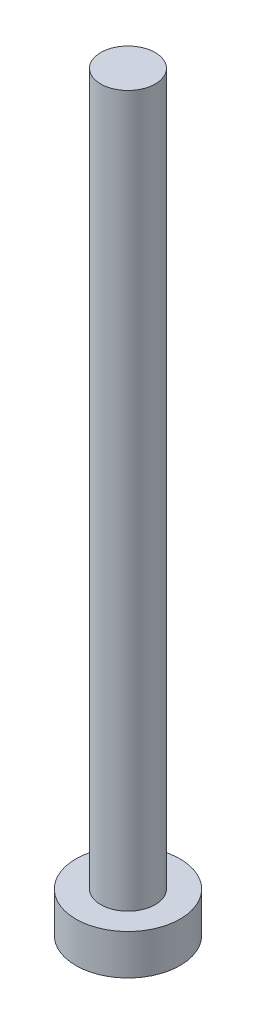
ISO-10303-21;
HEADER;
FILE_DESCRIPTION(('STEP AP214'),'2;1');
FILE_NAME('part.step','',(''),(''),'','','');
FILE_SCHEMA(('AUTOMOTIVE_DESIGN { 1 0 10303 214 1 1 1 1 }'));
ENDSEC;
DATA;
#1=APPLICATION_CONTEXT('core data for automotive mechanical design processes');
#2=APPLICATION_PROTOCOL_DEFINITION('international standard','automotive_design',2000,#1);
#3=PRODUCT_CONTEXT('',#1,'mechanical');
#4=PRODUCT('Part','Part','',(#3));
#5=PRODUCT_RELATED_PRODUCT_CATEGORY('part','',(#4));
#6=PRODUCT_DEFINITION_FORMATION('','',#4);
#7=PRODUCT_DEFINITION_CONTEXT('part definition',#1,'design');
#8=PRODUCT_DEFINITION('design','',#6,#7);
#9=PRODUCT_DEFINITION_SHAPE('','',#8);
#10=(LENGTH_UNIT() NAMED_UNIT(*) SI_UNIT(.MILLI.,.METRE.));
#11=(NAMED_UNIT(*) PLANE_ANGLE_UNIT() SI_UNIT($,.RADIAN.));
#12=(NAMED_UNIT(*) SI_UNIT($,.STERADIAN.) SOLID_ANGLE_UNIT());
#13=UNCERTAINTY_MEASURE_WITH_UNIT(LENGTH_MEASURE(1.E-05),#10,'distance_accuracy_value','');
#14=(GEOMETRIC_REPRESENTATION_CONTEXT(3) GLOBAL_UNCERTAINTY_ASSIGNED_CONTEXT((#13)) GLOBAL_UNIT_ASSIGNED_CONTEXT((#10,
#11,#12)) REPRESENTATION_CONTEXT('',''));
#15=CARTESIAN_POINT('',(0.,0.,0.));
#16=DIRECTION('',(0.,0.,1.));
#17=DIRECTION('',(1.,0.,0.));
#18=AXIS2_PLACEMENT_3D('',#15,#16,#17);
#19=CARTESIAN_POINT('',(0.,0.,0.));
#20=DIRECTION('',(0.,1.,0.));
#21=DIRECTION('',(0.,0.,1.));
#22=AXIS2_PLACEMENT_3D('',#19,#20,#21);
#23=PLANE('',#22);
#24=CARTESIAN_POINT('',(0.,0.,0.));
#25=DIRECTION('',(0.,1.,0.));
#26=DIRECTION('',(0.,0.,1.));
#27=AXIS2_PLACEMENT_3D('',#24,#25,#26);
#28=CIRCLE('',#27,2.2);
#29=CARTESIAN_POINT('',(0.,0.,2.2));
#30=VERTEX_POINT('',#29);
#31=EDGE_CURVE('E67',#30,#30,#28,.T.);
#32=ORIENTED_EDGE('',*,*,#31,.F.);
#33=EDGE_LOOP('',(#32));
#34=FACE_BOUND('',#33,.T.);
#35=DIRECTION('',(1.,0.,0.));
#36=VECTOR('',#35,1.);
#37=CARTESIAN_POINT('',(-0.25,0.,0.85));
#38=LINE('',#37,#36);
#39=CARTESIAN_POINT('',(-0.25,0.,0.85));
#40=VERTEX_POINT('',#39);
#41=CARTESIAN_POINT('',(0.25,0.,0.85));
#42=VERTEX_POINT('',#41);
#43=EDGE_CURVE('E247',#40,#42,#38,.T.);
#44=ORIENTED_EDGE('',*,*,#43,.T.);
#45=DIRECTION('',(0.,0.,-1.));
#46=VECTOR('',#45,1.);
#47=CARTESIAN_POINT('',(0.25,0.,0.85));
#48=LINE('',#47,#46);
#49=CARTESIAN_POINT('',(0.25,0.,0.25));
#50=VERTEX_POINT('',#49);
#51=EDGE_CURVE('E273',#42,#50,#48,.T.);
#52=ORIENTED_EDGE('',*,*,#51,.T.);
#53=DIRECTION('',(1.,0.,0.));
#54=VECTOR('',#53,1.);
#55=CARTESIAN_POINT('',(-0.85,0.,0.25));
#56=LINE('',#55,#54);
#57=CARTESIAN_POINT('',(0.85,0.,0.25));
#58=VERTEX_POINT('',#57);
#59=EDGE_CURVE('E136',#50,#58,#56,.T.);
#60=ORIENTED_EDGE('',*,*,#59,.T.);
#61=DIRECTION('',(0.,0.,-1.));
#62=VECTOR('',#61,1.);
#63=CARTESIAN_POINT('',(0.85,0.,0.25));
#64=LINE('',#63,#62);
#65=CARTESIAN_POINT('',(0.85,0.,-0.25));
#66=VERTEX_POINT('',#65);
#67=EDGE_CURVE('E150',#58,#66,#64,.T.);
#68=ORIENTED_EDGE('',*,*,#67,.T.);
#69=DIRECTION('',(1.,0.,0.));
#70=VECTOR('',#69,1.);
#71=CARTESIAN_POINT('',(-0.85,0.,-0.25));
#72=LINE('',#71,#70);
#73=CARTESIAN_POINT('',(0.25,0.,-0.25));
#74=VERTEX_POINT('',#73);
#75=EDGE_CURVE('E143',#74,#66,#72,.T.);
#76=ORIENTED_EDGE('',*,*,#75,.F.);
#77=CARTESIAN_POINT('',(0.25,0.,-0.85));
#78=VERTEX_POINT('',#77);
#79=EDGE_CURVE('E272',#74,#78,#48,.T.);
#80=ORIENTED_EDGE('',*,*,#79,.T.);
#81=DIRECTION('',(1.,0.,0.));
#82=VECTOR('',#81,1.);
#83=CARTESIAN_POINT('',(-0.25,0.,-0.85));
#84=LINE('',#83,#82);
#85=CARTESIAN_POINT('',(-0.25,0.,-0.85));
#86=VERTEX_POINT('',#85);
#87=EDGE_CURVE('E270',#86,#78,#84,.T.);
#88=ORIENTED_EDGE('',*,*,#87,.F.);
#89=DIRECTION('',(0.,0.,-1.));
#90=VECTOR('',#89,1.);
#91=CARTESIAN_POINT('',(-0.25,0.,0.85));
#92=LINE('',#91,#90);
#93=CARTESIAN_POINT('',(-0.25,0.,-0.25));
#94=VERTEX_POINT('',#93);
#95=EDGE_CURVE('E123',#94,#86,#92,.T.);
#96=ORIENTED_EDGE('',*,*,#95,.F.);
#97=CARTESIAN_POINT('',(-0.85,0.,-0.25));
#98=VERTEX_POINT('',#97);
#99=EDGE_CURVE('E142',#98,#94,#72,.T.);
#100=ORIENTED_EDGE('',*,*,#99,.F.);
#101=DIRECTION('',(0.,0.,-1.));
#102=VECTOR('',#101,1.);
#103=CARTESIAN_POINT('',(-0.85,0.,0.25));
#104=LINE('',#103,#102);
#105=CARTESIAN_POINT('',(-0.85,0.,0.25));
#106=VERTEX_POINT('',#105);
#107=EDGE_CURVE('E80',#106,#98,#104,.T.);
#108=ORIENTED_EDGE('',*,*,#107,.F.);
#109=CARTESIAN_POINT('',(-0.25,0.,0.25));
#110=VERTEX_POINT('',#109);
#111=EDGE_CURVE('E128',#106,#110,#56,.T.);
#112=ORIENTED_EDGE('',*,*,#111,.T.);
#113=EDGE_CURVE('E268',#40,#110,#92,.T.);
#114=ORIENTED_EDGE('',*,*,#113,.F.);
#115=EDGE_LOOP('',(#44,#52,#60,#68,#76,#80,#88,#96,#100,#108,#112,#114));
#116=FACE_BOUND('',#115,.T.);
#117=ADVANCED_FACE('F63',(#34,#116),#23,.F.);
#118=CARTESIAN_POINT('',(0.,1.7,0.));
#119=DIRECTION('',(0.,-1.,0.));
#120=DIRECTION('',(0.,0.,-1.));
#121=AXIS2_PLACEMENT_3D('',#118,#119,#120);
#122=CYLINDRICAL_SURFACE('',#121,2.2);
#123=CARTESIAN_POINT('',(0.,1.7,0.));
#124=DIRECTION('',(0.,1.,0.));
#125=DIRECTION('',(0.,0.,1.));
#126=AXIS2_PLACEMENT_3D('',#123,#124,#125);
#127=CIRCLE('',#126,2.2);
#128=CARTESIAN_POINT('',(0.,1.7,2.2));
#129=VERTEX_POINT('',#128);
#130=EDGE_CURVE('E72',#129,#129,#127,.T.);
#131=ORIENTED_EDGE('',*,*,#130,.F.);
#132=EDGE_LOOP('',(#131));
#133=FACE_BOUND('',#132,.T.);
#134=ORIENTED_EDGE('',*,*,#31,.T.);
#135=EDGE_LOOP('',(#134));
#136=FACE_BOUND('',#135,.T.);
#137=ADVANCED_FACE('F65',(#133,#136),#122,.T.);
#138=CARTESIAN_POINT('',(0.,1.7,0.));
#139=DIRECTION('',(0.,1.,0.));
#140=DIRECTION('',(0.,0.,1.));
#141=AXIS2_PLACEMENT_3D('',#138,#139,#140);
#142=PLANE('',#141);
#143=CARTESIAN_POINT('',(0.,1.7,0.));
#144=DIRECTION('',(0.,1.,0.));
#145=DIRECTION('',(0.,0.,1.));
#146=AXIS2_PLACEMENT_3D('',#143,#144,#145);
#147=CIRCLE('',#146,1.15);
#148=CARTESIAN_POINT('',(0.,1.7,1.15));
#149=VERTEX_POINT('',#148);
#150=EDGE_CURVE('E12',#149,#149,#147,.T.);
#151=ORIENTED_EDGE('',*,*,#150,.F.);
#152=EDGE_LOOP('',(#151));
#153=FACE_BOUND('',#152,.T.);
#154=ORIENTED_EDGE('',*,*,#130,.T.);
#155=EDGE_LOOP('',(#154));
#156=FACE_BOUND('',#155,.T.);
#157=ADVANCED_FACE('F181',(#153,#156),#142,.T.);
#158=CARTESIAN_POINT('',(0.,31.7,0.));
#159=DIRECTION('',(0.,-1.,0.));
#160=DIRECTION('',(0.,0.,-1.));
#161=AXIS2_PLACEMENT_3D('',#158,#159,#160);
#162=CYLINDRICAL_SURFACE('',#161,1.15);
#163=CARTESIAN_POINT('',(0.,31.7,0.));
#164=DIRECTION('',(0.,1.,0.));
#165=DIRECTION('',(0.,0.,1.));
#166=AXIS2_PLACEMENT_3D('',#163,#164,#165);
#167=CIRCLE('',#166,1.15);
#168=CARTESIAN_POINT('',(0.,31.7,1.15));
#169=VERTEX_POINT('',#168);
#170=EDGE_CURVE('E168',#169,#169,#167,.T.);
#171=ORIENTED_EDGE('',*,*,#170,.F.);
#172=EDGE_LOOP('',(#171));
#173=FACE_BOUND('',#172,.T.);
#174=ORIENTED_EDGE('',*,*,#150,.T.);
#175=EDGE_LOOP('',(#174));
#176=FACE_BOUND('',#175,.T.);
#177=ADVANCED_FACE('F186',(#173,#176),#162,.T.);
#178=CARTESIAN_POINT('',(0.,31.7,0.));
#179=DIRECTION('',(0.,1.,0.));
#180=DIRECTION('',(0.,0.,1.));
#181=AXIS2_PLACEMENT_3D('',#178,#179,#180);
#182=PLANE('',#181);
#183=ORIENTED_EDGE('',*,*,#170,.T.);
#184=EDGE_LOOP('',(#183));
#185=FACE_BOUND('',#184,.T.);
#186=ADVANCED_FACE('F190',(#185),#182,.T.);
#187=CARTESIAN_POINT('',(0.25,1.5,0.85));
#188=DIRECTION('',(-1.,0.,0.));
#189=DIRECTION('',(0.,0.,1.));
#190=AXIS2_PLACEMENT_3D('',#187,#188,#189);
#191=PLANE('',#190);
#192=DIRECTION('',(0.,0.,-1.));
#193=VECTOR('',#192,1.);
#194=CARTESIAN_POINT('',(0.25,1.5,0.85));
#195=LINE('',#194,#193);
#196=CARTESIAN_POINT('',(0.25,1.5,-0.25));
#197=VERTEX_POINT('',#196);
#198=CARTESIAN_POINT('',(0.25,1.5,-0.85));
#199=VERTEX_POINT('',#198);
#200=EDGE_CURVE('E259',#197,#199,#195,.T.);
#201=ORIENTED_EDGE('',*,*,#200,.T.);
#202=DIRECTION('',(0.,-1.,0.));
#203=VECTOR('',#202,1.);
#204=CARTESIAN_POINT('',(0.25,1.5,-0.85));
#205=LINE('',#204,#203);
#206=EDGE_CURVE('E254',#199,#78,#205,.T.);
#207=ORIENTED_EDGE('',*,*,#206,.T.);
#208=ORIENTED_EDGE('',*,*,#79,.F.);
#209=DIRECTION('',(0.,-1.,0.));
#210=VECTOR('',#209,1.);
#211=CARTESIAN_POINT('',(0.25,1.5,-0.25));
#212=LINE('',#211,#210);
#213=EDGE_CURVE('E89',#197,#74,#212,.T.);
#214=ORIENTED_EDGE('',*,*,#213,.F.);
#215=EDGE_LOOP('',(#201,#207,#208,#214));
#216=FACE_BOUND('',#215,.T.);
#217=ADVANCED_FACE('F194',(#216),#191,.T.);
#218=CARTESIAN_POINT('',(-0.25,1.5,-0.85));
#219=DIRECTION('',(0.,0.,-1.));
#220=DIRECTION('',(-1.,0.,0.));
#221=AXIS2_PLACEMENT_3D('',#218,#219,#220);
#222=PLANE('',#221);
#223=ORIENTED_EDGE('',*,*,#87,.T.);
#224=ORIENTED_EDGE('',*,*,#206,.F.);
#225=DIRECTION('',(1.,0.,0.));
#226=VECTOR('',#225,1.);
#227=CARTESIAN_POINT('',(-0.25,1.5,-0.85));
#228=LINE('',#227,#226);
#229=CARTESIAN_POINT('',(-0.25,1.5,-0.85));
#230=VERTEX_POINT('',#229);
#231=EDGE_CURVE('E241',#230,#199,#228,.T.);
#232=ORIENTED_EDGE('',*,*,#231,.F.);
#233=DIRECTION('',(0.,-1.,0.));
#234=VECTOR('',#233,1.);
#235=CARTESIAN_POINT('',(-0.25,1.5,-0.85));
#236=LINE('',#235,#234);
#237=EDGE_CURVE('E251',#230,#86,#236,.T.);
#238=ORIENTED_EDGE('',*,*,#237,.T.);
#239=EDGE_LOOP('',(#223,#224,#232,#238));
#240=FACE_BOUND('',#239,.T.);
#241=ADVANCED_FACE('F214',(#240),#222,.F.);
#242=CARTESIAN_POINT('',(-0.25,1.5,0.85));
#243=DIRECTION('',(-1.,0.,0.));
#244=DIRECTION('',(0.,0.,1.));
#245=AXIS2_PLACEMENT_3D('',#242,#243,#244);
#246=PLANE('',#245);
#247=DIRECTION('',(0.,-1.,0.));
#248=VECTOR('',#247,1.);
#249=CARTESIAN_POINT('',(-0.25,1.5,-0.25));
#250=LINE('',#249,#248);
#251=CARTESIAN_POINT('',(-0.25,1.5,-0.25));
#252=VERTEX_POINT('',#251);
#253=EDGE_CURVE('E162',#252,#94,#250,.T.);
#254=ORIENTED_EDGE('',*,*,#253,.T.);
#255=ORIENTED_EDGE('',*,*,#95,.T.);
#256=ORIENTED_EDGE('',*,*,#237,.F.);
#257=DIRECTION('',(0.,0.,-1.));
#258=VECTOR('',#257,1.);
#259=CARTESIAN_POINT('',(-0.25,1.5,0.85));
#260=LINE('',#259,#258);
#261=EDGE_CURVE('E236',#252,#230,#260,.T.);
#262=ORIENTED_EDGE('',*,*,#261,.F.);
#263=EDGE_LOOP('',(#254,#255,#256,#262));
#264=FACE_BOUND('',#263,.T.);
#265=ADVANCED_FACE('F210',(#264),#246,.F.);
#266=CARTESIAN_POINT('',(0.,1.5,0.));
#267=DIRECTION('',(0.,-1.,0.));
#268=DIRECTION('',(0.,0.,-1.));
#269=AXIS2_PLACEMENT_3D('',#266,#267,#268);
#270=PLANE('',#269);
#271=ORIENTED_EDGE('',*,*,#261,.T.);
#272=ORIENTED_EDGE('',*,*,#231,.T.);
#273=ORIENTED_EDGE('',*,*,#200,.F.);
#274=DIRECTION('',(1.,0.,0.));
#275=VECTOR('',#274,1.);
#276=CARTESIAN_POINT('',(-0.85,1.5,-0.25));
#277=LINE('',#276,#275);
#278=CARTESIAN_POINT('',(0.85,1.5,-0.25));
#279=VERTEX_POINT('',#278);
#280=EDGE_CURVE('E284',#197,#279,#277,.T.);
#281=ORIENTED_EDGE('',*,*,#280,.T.);
#282=DIRECTION('',(0.,0.,-1.));
#283=VECTOR('',#282,1.);
#284=CARTESIAN_POINT('',(0.85,1.5,0.25));
#285=LINE('',#284,#283);
#286=CARTESIAN_POINT('',(0.85,1.5,0.25));
#287=VERTEX_POINT('',#286);
#288=EDGE_CURVE('E285',#287,#279,#285,.T.);
#289=ORIENTED_EDGE('',*,*,#288,.F.);
#290=DIRECTION('',(1.,0.,0.));
#291=VECTOR('',#290,1.);
#292=CARTESIAN_POINT('',(-0.85,1.5,0.25));
#293=LINE('',#292,#291);
#294=CARTESIAN_POINT('',(0.25,1.5,0.25));
#295=VERTEX_POINT('',#294);
#296=EDGE_CURVE('E287',#295,#287,#293,.T.);
#297=ORIENTED_EDGE('',*,*,#296,.F.);
#298=CARTESIAN_POINT('',(0.25,1.5,0.85));
#299=VERTEX_POINT('',#298);
#300=EDGE_CURVE('E261',#299,#295,#195,.T.);
#301=ORIENTED_EDGE('',*,*,#300,.F.);
#302=DIRECTION('',(1.,0.,0.));
#303=VECTOR('',#302,1.);
#304=CARTESIAN_POINT('',(-0.25,1.5,0.85));
#305=LINE('',#304,#303);
#306=CARTESIAN_POINT('',(-0.25,1.5,0.85));
#307=VERTEX_POINT('',#306);
#308=EDGE_CURVE('E255',#307,#299,#305,.T.);
#309=ORIENTED_EDGE('',*,*,#308,.F.);
#310=CARTESIAN_POINT('',(-0.25,1.5,0.25));
#311=VERTEX_POINT('',#310);
#312=EDGE_CURVE('E246',#307,#311,#260,.T.);
#313=ORIENTED_EDGE('',*,*,#312,.T.);
#314=CARTESIAN_POINT('',(-0.85,1.5,0.25));
#315=VERTEX_POINT('',#314);
#316=EDGE_CURVE('E147',#315,#311,#293,.T.);
#317=ORIENTED_EDGE('',*,*,#316,.F.);
#318=DIRECTION('',(0.,0.,-1.));
#319=VECTOR('',#318,1.);
#320=CARTESIAN_POINT('',(-0.85,1.5,0.25));
#321=LINE('',#320,#319);
#322=CARTESIAN_POINT('',(-0.85,1.5,-0.25));
#323=VERTEX_POINT('',#322);
#324=EDGE_CURVE('E119',#315,#323,#321,.T.);
#325=ORIENTED_EDGE('',*,*,#324,.T.);
#326=EDGE_CURVE('E243',#323,#252,#277,.T.);
#327=ORIENTED_EDGE('',*,*,#326,.T.);
#328=EDGE_LOOP('',(#271,#272,#273,#281,#289,#297,#301,#309,#313,#317,#325,#327));
#329=FACE_BOUND('',#328,.T.);
#330=ADVANCED_FACE('F213',(#329),#270,.T.);
#331=CARTESIAN_POINT('',(-0.25,1.5,0.85));
#332=DIRECTION('',(0.,0.,-1.));
#333=DIRECTION('',(-1.,0.,0.));
#334=AXIS2_PLACEMENT_3D('',#331,#332,#333);
#335=PLANE('',#334);
#336=ORIENTED_EDGE('',*,*,#43,.F.);
#337=DIRECTION('',(0.,-1.,0.));
#338=VECTOR('',#337,1.);
#339=CARTESIAN_POINT('',(-0.25,1.5,0.85));
#340=LINE('',#339,#338);
#341=EDGE_CURVE('E161',#307,#40,#340,.T.);
#342=ORIENTED_EDGE('',*,*,#341,.F.);
#343=ORIENTED_EDGE('',*,*,#308,.T.);
#344=DIRECTION('',(0.,-1.,0.));
#345=VECTOR('',#344,1.);
#346=CARTESIAN_POINT('',(0.25,1.5,0.85));
#347=LINE('',#346,#345);
#348=EDGE_CURVE('E279',#299,#42,#347,.T.);
#349=ORIENTED_EDGE('',*,*,#348,.T.);
#350=EDGE_LOOP('',(#336,#342,#343,#349));
#351=FACE_BOUND('',#350,.T.);
#352=ADVANCED_FACE('F223',(#351),#335,.T.);
#353=DIRECTION('',(0.,-1.,0.));
#354=VECTOR('',#353,1.);
#355=CARTESIAN_POINT('',(0.25,1.5,0.25));
#356=LINE('',#355,#354);
#357=EDGE_CURVE('E160',#295,#50,#356,.T.);
#358=ORIENTED_EDGE('',*,*,#357,.T.);
#359=ORIENTED_EDGE('',*,*,#51,.F.);
#360=ORIENTED_EDGE('',*,*,#348,.F.);
#361=ORIENTED_EDGE('',*,*,#300,.T.);
#362=EDGE_LOOP('',(#358,#359,#360,#361));
#363=FACE_BOUND('',#362,.T.);
#364=ADVANCED_FACE('F222',(#363),#191,.T.);
#365=ORIENTED_EDGE('',*,*,#312,.F.);
#366=ORIENTED_EDGE('',*,*,#341,.T.);
#367=ORIENTED_EDGE('',*,*,#113,.T.);
#368=DIRECTION('',(0.,-1.,0.));
#369=VECTOR('',#368,1.);
#370=CARTESIAN_POINT('',(-0.25,1.5,0.25));
#371=LINE('',#370,#369);
#372=EDGE_CURVE('E132',#311,#110,#371,.T.);
#373=ORIENTED_EDGE('',*,*,#372,.F.);
#374=EDGE_LOOP('',(#365,#366,#367,#373));
#375=FACE_BOUND('',#374,.T.);
#376=ADVANCED_FACE('F216',(#375),#246,.F.);
#377=CARTESIAN_POINT('',(-0.85,1.5,0.25));
#378=DIRECTION('',(0.,0.,-1.));
#379=DIRECTION('',(-1.,0.,0.));
#380=AXIS2_PLACEMENT_3D('',#377,#378,#379);
#381=PLANE('',#380);
#382=ORIENTED_EDGE('',*,*,#296,.T.);
#383=DIRECTION('',(0.,-1.,0.));
#384=VECTOR('',#383,1.);
#385=CARTESIAN_POINT('',(0.85,1.5,0.25));
#386=LINE('',#385,#384);
#387=EDGE_CURVE('E124',#287,#58,#386,.T.);
#388=ORIENTED_EDGE('',*,*,#387,.T.);
#389=ORIENTED_EDGE('',*,*,#59,.F.);
#390=ORIENTED_EDGE('',*,*,#357,.F.);
#391=EDGE_LOOP('',(#382,#388,#389,#390));
#392=FACE_BOUND('',#391,.T.);
#393=ADVANCED_FACE('F206',(#392),#381,.T.);
#394=CARTESIAN_POINT('',(0.85,1.5,0.25));
#395=DIRECTION('',(-1.,0.,0.));
#396=DIRECTION('',(0.,0.,1.));
#397=AXIS2_PLACEMENT_3D('',#394,#395,#396);
#398=PLANE('',#397);
#399=ORIENTED_EDGE('',*,*,#67,.F.);
#400=ORIENTED_EDGE('',*,*,#387,.F.);
#401=ORIENTED_EDGE('',*,*,#288,.T.);
#402=DIRECTION('',(0.,-1.,0.));
#403=VECTOR('',#402,1.);
#404=CARTESIAN_POINT('',(0.85,1.5,-0.25));
#405=LINE('',#404,#403);
#406=EDGE_CURVE('E154',#279,#66,#405,.T.);
#407=ORIENTED_EDGE('',*,*,#406,.T.);
#408=EDGE_LOOP('',(#399,#400,#401,#407));
#409=FACE_BOUND('',#408,.T.);
#410=ADVANCED_FACE('F203',(#409),#398,.T.);
#411=CARTESIAN_POINT('',(-0.85,1.5,-0.25));
#412=DIRECTION('',(0.,0.,-1.));
#413=DIRECTION('',(-1.,0.,0.));
#414=AXIS2_PLACEMENT_3D('',#411,#412,#413);
#415=PLANE('',#414);
#416=ORIENTED_EDGE('',*,*,#213,.T.);
#417=ORIENTED_EDGE('',*,*,#75,.T.);
#418=ORIENTED_EDGE('',*,*,#406,.F.);
#419=ORIENTED_EDGE('',*,*,#280,.F.);
#420=EDGE_LOOP('',(#416,#417,#418,#419));
#421=FACE_BOUND('',#420,.T.);
#422=ADVANCED_FACE('F198',(#421),#415,.F.);
#423=CARTESIAN_POINT('',(-0.85,1.5,0.25));
#424=DIRECTION('',(-1.,0.,0.));
#425=DIRECTION('',(0.,0.,1.));
#426=AXIS2_PLACEMENT_3D('',#423,#424,#425);
#427=PLANE('',#426);
#428=ORIENTED_EDGE('',*,*,#107,.T.);
#429=DIRECTION('',(0.,-1.,0.));
#430=VECTOR('',#429,1.);
#431=CARTESIAN_POINT('',(-0.85,1.5,-0.25));
#432=LINE('',#431,#430);
#433=EDGE_CURVE('E157',#323,#98,#432,.T.);
#434=ORIENTED_EDGE('',*,*,#433,.F.);
#435=ORIENTED_EDGE('',*,*,#324,.F.);
#436=DIRECTION('',(0.,-1.,0.));
#437=VECTOR('',#436,1.);
#438=CARTESIAN_POINT('',(-0.85,1.5,0.25));
#439=LINE('',#438,#437);
#440=EDGE_CURVE('E115',#315,#106,#439,.T.);
#441=ORIENTED_EDGE('',*,*,#440,.T.);
#442=EDGE_LOOP('',(#428,#434,#435,#441));
#443=FACE_BOUND('',#442,.T.);
#444=ADVANCED_FACE('F117',(#443),#427,.F.);
#445=ORIENTED_EDGE('',*,*,#372,.T.);
#446=ORIENTED_EDGE('',*,*,#111,.F.);
#447=ORIENTED_EDGE('',*,*,#440,.F.);
#448=ORIENTED_EDGE('',*,*,#316,.T.);
#449=EDGE_LOOP('',(#445,#446,#447,#448));
#450=FACE_BOUND('',#449,.T.);
#451=ADVANCED_FACE('F129',(#450),#381,.T.);
#452=ORIENTED_EDGE('',*,*,#326,.F.);
#453=ORIENTED_EDGE('',*,*,#433,.T.);
#454=ORIENTED_EDGE('',*,*,#99,.T.);
#455=ORIENTED_EDGE('',*,*,#253,.F.);
#456=EDGE_LOOP('',(#452,#453,#454,#455));
#457=FACE_BOUND('',#456,.T.);
#458=ADVANCED_FACE('F199',(#457),#415,.F.);
#459=CLOSED_SHELL('',(#117,#137,#157,#177,#186,#217,#241,#265,#330,#352,#364,#376,#393,#410,
#422,#444,#451,#458));
#460=MANIFOLD_SOLID_BREP('B2',#459);
#461=ADVANCED_BREP_SHAPE_REPRESENTATION('',(#18,#460),#14);
#462=SHAPE_DEFINITION_REPRESENTATION(#9,#461);
ENDSEC;
END-ISO-10303-21;
